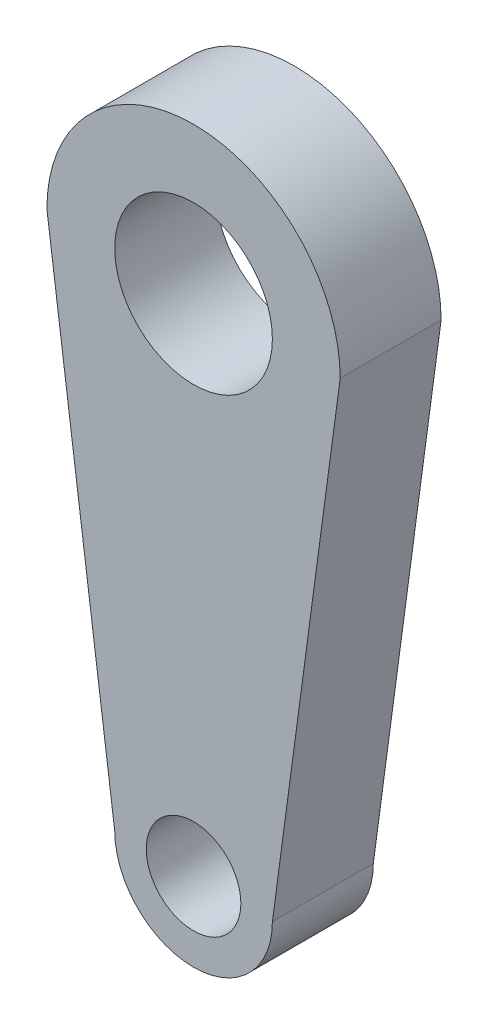
ISO-10303-21;
HEADER;
FILE_DESCRIPTION(('STEP AP214'),'2;1');
FILE_NAME('part.step','',(''),(''),'','','');
FILE_SCHEMA(('AUTOMOTIVE_DESIGN { 1 0 10303 214 1 1 1 1 }'));
ENDSEC;
DATA;
#1=APPLICATION_CONTEXT('core data for automotive mechanical design processes');
#2=APPLICATION_PROTOCOL_DEFINITION('international standard','automotive_design',2000,#1);
#3=PRODUCT_CONTEXT('',#1,'mechanical');
#4=PRODUCT('Part','Part','',(#3));
#5=PRODUCT_RELATED_PRODUCT_CATEGORY('part','',(#4));
#6=PRODUCT_DEFINITION_FORMATION('','',#4);
#7=PRODUCT_DEFINITION_CONTEXT('part definition',#1,'design');
#8=PRODUCT_DEFINITION('design','',#6,#7);
#9=PRODUCT_DEFINITION_SHAPE('','',#8);
#10=(LENGTH_UNIT() NAMED_UNIT(*) SI_UNIT(.MILLI.,.METRE.));
#11=(NAMED_UNIT(*) PLANE_ANGLE_UNIT() SI_UNIT($,.RADIAN.));
#12=(NAMED_UNIT(*) SI_UNIT($,.STERADIAN.) SOLID_ANGLE_UNIT());
#13=UNCERTAINTY_MEASURE_WITH_UNIT(LENGTH_MEASURE(1.E-05),#10,'distance_accuracy_value','');
#14=(GEOMETRIC_REPRESENTATION_CONTEXT(3) GLOBAL_UNCERTAINTY_ASSIGNED_CONTEXT((#13)) GLOBAL_UNIT_ASSIGNED_CONTEXT((#10,
#11,#12)) REPRESENTATION_CONTEXT('',''));
#15=CARTESIAN_POINT('',(0.,0.,0.));
#16=DIRECTION('',(0.,0.,1.));
#17=DIRECTION('',(1.,0.,0.));
#18=AXIS2_PLACEMENT_3D('',#15,#16,#17);
#19=CARTESIAN_POINT('',(0.,5.425,-3.2));
#20=DIRECTION('',(0.,0.,-1.));
#21=DIRECTION('',(1.,0.,0.));
#22=AXIS2_PLACEMENT_3D('',#19,#20,#21);
#23=PLANE('',#22);
#24=CARTESIAN_POINT('',(0.,-10.575,-3.2));
#25=DIRECTION('',(0.,0.,1.));
#26=DIRECTION('',(1.,0.,0.));
#27=AXIS2_PLACEMENT_3D('',#24,#25,#26);
#28=CIRCLE('',#27,1.5);
#29=CARTESIAN_POINT('',(1.5,-10.575,-3.2));
#30=VERTEX_POINT('',#29);
#31=EDGE_CURVE('E111',#30,#30,#28,.T.);
#32=ORIENTED_EDGE('',*,*,#31,.T.);
#33=EDGE_LOOP('',(#32));
#34=FACE_BOUND('',#33,.T.);
#35=CARTESIAN_POINT('',(0.,5.425,-3.2));
#36=DIRECTION('',(0.,0.,1.));
#37=DIRECTION('',(1.,0.,0.));
#38=AXIS2_PLACEMENT_3D('',#35,#36,#37);
#39=CIRCLE('',#38,4.65);
#40=CARTESIAN_POINT('',(4.65,5.425,-3.2));
#41=VERTEX_POINT('',#40);
#42=CARTESIAN_POINT('',(-4.65,5.42499999999997,-3.2));
#43=VERTEX_POINT('',#42);
#44=EDGE_CURVE('E99',#41,#43,#39,.T.);
#45=ORIENTED_EDGE('',*,*,#44,.F.);
#46=DIRECTION('',(0.133178005557701,0.99109213438291,0.));
#47=VECTOR('',#46,1.);
#48=CARTESIAN_POINT('',(4.65,5.425,-3.2));
#49=LINE('',#48,#47);
#50=CARTESIAN_POINT('',(2.50000000000005,-10.575,-3.2));
#51=VERTEX_POINT('',#50);
#52=EDGE_CURVE('E102',#51,#41,#49,.T.);
#53=ORIENTED_EDGE('',*,*,#52,.F.);
#54=CARTESIAN_POINT('',(0.,-10.575,-3.2));
#55=DIRECTION('',(0.,0.,1.));
#56=DIRECTION('',(1.,0.,0.));
#57=AXIS2_PLACEMENT_3D('',#54,#55,#56);
#58=CIRCLE('',#57,2.50000000000005);
#59=CARTESIAN_POINT('',(-2.50000000000005,-10.575,-3.2));
#60=VERTEX_POINT('',#59);
#61=EDGE_CURVE('E90',#60,#51,#58,.T.);
#62=ORIENTED_EDGE('',*,*,#61,.F.);
#63=DIRECTION('',(0.133178005557701,-0.99109213438291,0.));
#64=VECTOR('',#63,1.);
#65=CARTESIAN_POINT('',(-4.65,5.42499999999997,-3.2));
#66=LINE('',#65,#64);
#67=EDGE_CURVE('E95',#43,#60,#66,.T.);
#68=ORIENTED_EDGE('',*,*,#67,.F.);
#69=EDGE_LOOP('',(#45,#53,#62,#68));
#70=FACE_BOUND('',#69,.T.);
#71=CARTESIAN_POINT('',(0.,5.425,-3.2));
#72=DIRECTION('',(0.,0.,1.));
#73=DIRECTION('',(1.,0.,0.));
#74=AXIS2_PLACEMENT_3D('',#71,#72,#73);
#75=CIRCLE('',#74,2.5);
#76=CARTESIAN_POINT('',(2.5,5.425,-3.2));
#77=VERTEX_POINT('',#76);
#78=EDGE_CURVE('E122',#77,#77,#75,.T.);
#79=ORIENTED_EDGE('',*,*,#78,.T.);
#80=EDGE_LOOP('',(#79));
#81=FACE_BOUND('',#80,.T.);
#82=ADVANCED_FACE('F43',(#34,#70,#81),#23,.T.);
#83=CARTESIAN_POINT('',(0.,5.425,0.));
#84=DIRECTION('',(0.,0.,-1.));
#85=DIRECTION('',(1.,0.,0.));
#86=AXIS2_PLACEMENT_3D('',#83,#84,#85);
#87=PLANE('',#86);
#88=CARTESIAN_POINT('',(0.,5.425,0.));
#89=DIRECTION('',(0.,0.,1.));
#90=DIRECTION('',(1.,0.,0.));
#91=AXIS2_PLACEMENT_3D('',#88,#89,#90);
#92=CIRCLE('',#91,4.65);
#93=CARTESIAN_POINT('',(4.65,5.425,0.));
#94=VERTEX_POINT('',#93);
#95=CARTESIAN_POINT('',(-4.65,5.42499999999997,0.));
#96=VERTEX_POINT('',#95);
#97=EDGE_CURVE('E107',#94,#96,#92,.T.);
#98=ORIENTED_EDGE('',*,*,#97,.T.);
#99=DIRECTION('',(0.133178005557701,-0.99109213438291,0.));
#100=VECTOR('',#99,1.);
#101=CARTESIAN_POINT('',(-4.65,5.42499999999997,0.));
#102=LINE('',#101,#100);
#103=CARTESIAN_POINT('',(-2.50000000000005,-10.575,0.));
#104=VERTEX_POINT('',#103);
#105=EDGE_CURVE('E110',#96,#104,#102,.T.);
#106=ORIENTED_EDGE('',*,*,#105,.T.);
#107=CARTESIAN_POINT('',(0.,-10.575,0.));
#108=DIRECTION('',(0.,0.,1.));
#109=DIRECTION('',(1.,0.,0.));
#110=AXIS2_PLACEMENT_3D('',#107,#108,#109);
#111=CIRCLE('',#110,2.50000000000005);
#112=CARTESIAN_POINT('',(2.50000000000005,-10.575,0.));
#113=VERTEX_POINT('',#112);
#114=EDGE_CURVE('E93',#104,#113,#111,.T.);
#115=ORIENTED_EDGE('',*,*,#114,.T.);
#116=DIRECTION('',(0.133178005557701,0.99109213438291,0.));
#117=VECTOR('',#116,1.);
#118=CARTESIAN_POINT('',(4.65,5.425,0.));
#119=LINE('',#118,#117);
#120=EDGE_CURVE('E114',#113,#94,#119,.T.);
#121=ORIENTED_EDGE('',*,*,#120,.T.);
#122=EDGE_LOOP('',(#98,#106,#115,#121));
#123=FACE_BOUND('',#122,.T.);
#124=CARTESIAN_POINT('',(0.,-10.575,0.));
#125=DIRECTION('',(0.,0.,1.));
#126=DIRECTION('',(1.,0.,0.));
#127=AXIS2_PLACEMENT_3D('',#124,#125,#126);
#128=CIRCLE('',#127,1.5);
#129=CARTESIAN_POINT('',(1.5,-10.575,0.));
#130=VERTEX_POINT('',#129);
#131=EDGE_CURVE('E119',#130,#130,#128,.T.);
#132=ORIENTED_EDGE('',*,*,#131,.F.);
#133=EDGE_LOOP('',(#132));
#134=FACE_BOUND('',#133,.T.);
#135=CARTESIAN_POINT('',(0.,5.425,0.));
#136=DIRECTION('',(0.,0.,1.));
#137=DIRECTION('',(1.,0.,0.));
#138=AXIS2_PLACEMENT_3D('',#135,#136,#137);
#139=CIRCLE('',#138,2.5);
#140=CARTESIAN_POINT('',(2.5,5.425,0.));
#141=VERTEX_POINT('',#140);
#142=EDGE_CURVE('E125',#141,#141,#139,.T.);
#143=ORIENTED_EDGE('',*,*,#142,.F.);
#144=EDGE_LOOP('',(#143));
#145=FACE_BOUND('',#144,.T.);
#146=ADVANCED_FACE('F138',(#123,#134,#145),#87,.F.);
#147=CARTESIAN_POINT('',(0.,5.425,-3.2));
#148=DIRECTION('',(0.,0.,1.));
#149=DIRECTION('',(-1.,0.,0.));
#150=AXIS2_PLACEMENT_3D('',#147,#148,#149);
#151=CYLINDRICAL_SURFACE('',#150,4.65);
#152=ORIENTED_EDGE('',*,*,#97,.F.);
#153=DIRECTION('',(0.,0.,1.));
#154=VECTOR('',#153,1.);
#155=CARTESIAN_POINT('',(4.65,5.425,-3.2));
#156=LINE('',#155,#154);
#157=EDGE_CURVE('E60',#41,#94,#156,.T.);
#158=ORIENTED_EDGE('',*,*,#157,.F.);
#159=ORIENTED_EDGE('',*,*,#44,.T.);
#160=DIRECTION('',(0.,0.,1.));
#161=VECTOR('',#160,1.);
#162=CARTESIAN_POINT('',(-4.65,5.42499999999997,-3.2));
#163=LINE('',#162,#161);
#164=EDGE_CURVE('E11',#43,#96,#163,.T.);
#165=ORIENTED_EDGE('',*,*,#164,.T.);
#166=EDGE_LOOP('',(#152,#158,#159,#165));
#167=FACE_BOUND('',#166,.T.);
#168=ADVANCED_FACE('F45',(#167),#151,.T.);
#169=CARTESIAN_POINT('',(-4.65,5.42499999999997,-3.2));
#170=DIRECTION('',(0.99109213438291,0.133178005557701,0.));
#171=DIRECTION('',(-0.133178005557701,0.991092134382911,0.));
#172=AXIS2_PLACEMENT_3D('',#169,#170,#171);
#173=PLANE('',#172);
#174=ORIENTED_EDGE('',*,*,#105,.F.);
#175=ORIENTED_EDGE('',*,*,#164,.F.);
#176=ORIENTED_EDGE('',*,*,#67,.T.);
#177=DIRECTION('',(0.,0.,1.));
#178=VECTOR('',#177,1.);
#179=CARTESIAN_POINT('',(-2.50000000000005,-10.575,-3.2));
#180=LINE('',#179,#178);
#181=EDGE_CURVE('E52',#60,#104,#180,.T.);
#182=ORIENTED_EDGE('',*,*,#181,.T.);
#183=EDGE_LOOP('',(#174,#175,#176,#182));
#184=FACE_BOUND('',#183,.T.);
#185=ADVANCED_FACE('F96',(#184),#173,.F.);
#186=CARTESIAN_POINT('',(0.,-10.575,-3.2));
#187=DIRECTION('',(0.,0.,1.));
#188=DIRECTION('',(-1.,0.,0.));
#189=AXIS2_PLACEMENT_3D('',#186,#187,#188);
#190=CYLINDRICAL_SURFACE('',#189,2.50000000000005);
#191=ORIENTED_EDGE('',*,*,#114,.F.);
#192=ORIENTED_EDGE('',*,*,#181,.F.);
#193=ORIENTED_EDGE('',*,*,#61,.T.);
#194=DIRECTION('',(0.,0.,1.));
#195=VECTOR('',#194,1.);
#196=CARTESIAN_POINT('',(2.50000000000005,-10.575,-3.2));
#197=LINE('',#196,#195);
#198=EDGE_CURVE('E76',#51,#113,#197,.T.);
#199=ORIENTED_EDGE('',*,*,#198,.T.);
#200=EDGE_LOOP('',(#191,#192,#193,#199));
#201=FACE_BOUND('',#200,.T.);
#202=ADVANCED_FACE('F88',(#201),#190,.T.);
#203=CARTESIAN_POINT('',(4.65,5.425,-3.2));
#204=DIRECTION('',(-0.99109213438291,0.133178005557701,0.));
#205=DIRECTION('',(-0.133178005557701,-0.991092134382911,0.));
#206=AXIS2_PLACEMENT_3D('',#203,#204,#205);
#207=PLANE('',#206);
#208=ORIENTED_EDGE('',*,*,#120,.F.);
#209=ORIENTED_EDGE('',*,*,#198,.F.);
#210=ORIENTED_EDGE('',*,*,#52,.T.);
#211=ORIENTED_EDGE('',*,*,#157,.T.);
#212=EDGE_LOOP('',(#208,#209,#210,#211));
#213=FACE_BOUND('',#212,.T.);
#214=ADVANCED_FACE('F150',(#213),#207,.F.);
#215=CARTESIAN_POINT('',(0.,-10.575,-3.2));
#216=DIRECTION('',(0.,0.,1.));
#217=DIRECTION('',(-1.,0.,0.));
#218=AXIS2_PLACEMENT_3D('',#215,#216,#217);
#219=CYLINDRICAL_SURFACE('',#218,1.5);
#220=ORIENTED_EDGE('',*,*,#31,.F.);
#221=EDGE_LOOP('',(#220));
#222=FACE_BOUND('',#221,.T.);
#223=ORIENTED_EDGE('',*,*,#131,.T.);
#224=EDGE_LOOP('',(#223));
#225=FACE_BOUND('',#224,.T.);
#226=ADVANCED_FACE('F134',(#222,#225),#219,.F.);
#227=CARTESIAN_POINT('',(0.,5.425,-3.2));
#228=DIRECTION('',(0.,0.,1.));
#229=DIRECTION('',(-1.,0.,0.));
#230=AXIS2_PLACEMENT_3D('',#227,#228,#229);
#231=CYLINDRICAL_SURFACE('',#230,2.5);
#232=ORIENTED_EDGE('',*,*,#78,.F.);
#233=EDGE_LOOP('',(#232));
#234=FACE_BOUND('',#233,.T.);
#235=ORIENTED_EDGE('',*,*,#142,.T.);
#236=EDGE_LOOP('',(#235));
#237=FACE_BOUND('',#236,.T.);
#238=ADVANCED_FACE('F131',(#234,#237),#231,.F.);
#239=CLOSED_SHELL('',(#82,#146,#168,#185,#202,#214,#226,#238));
#240=MANIFOLD_SOLID_BREP('B2',#239);
#241=ADVANCED_BREP_SHAPE_REPRESENTATION('',(#18,#240),#14);
#242=SHAPE_DEFINITION_REPRESENTATION(#9,#241);
ENDSEC;
END-ISO-10303-21;
